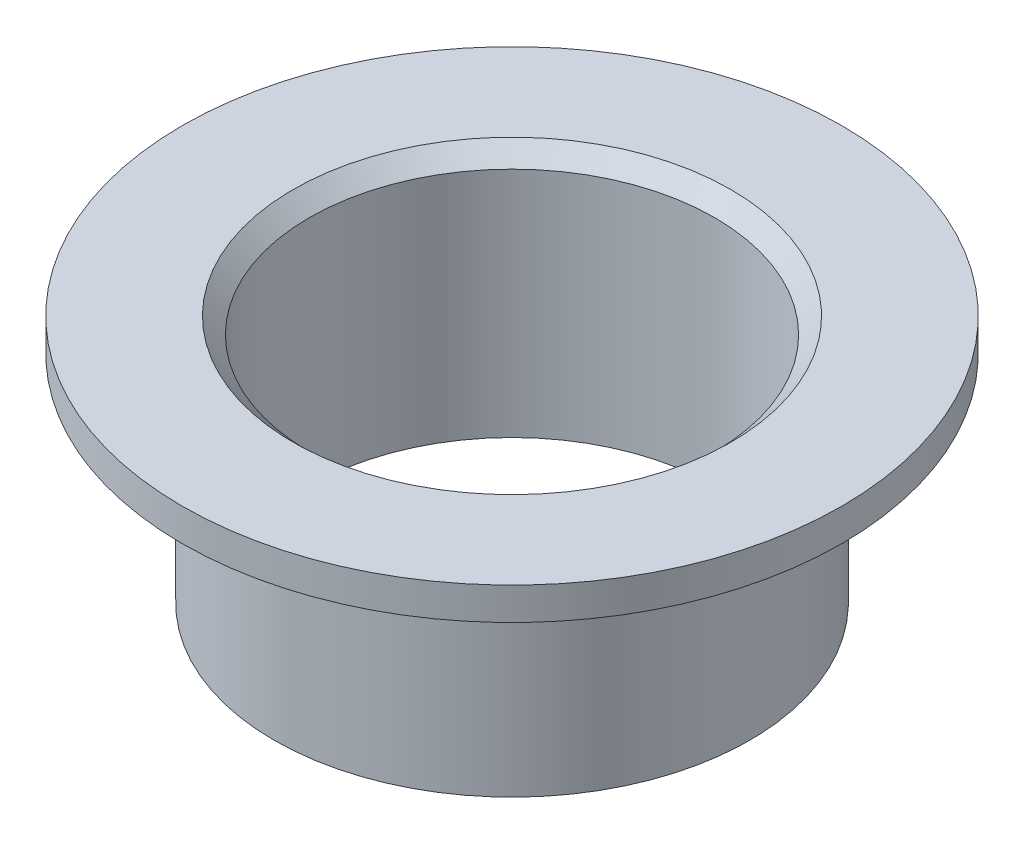
ISO-10303-21;
HEADER;
FILE_DESCRIPTION(('STEP AP214'),'2;1');
FILE_NAME('part.step','',(''),(''),'','','');
FILE_SCHEMA(('AUTOMOTIVE_DESIGN { 1 0 10303 214 1 1 1 1 }'));
ENDSEC;
DATA;
#1=APPLICATION_CONTEXT('core data for automotive mechanical design processes');
#2=APPLICATION_PROTOCOL_DEFINITION('international standard','automotive_design',2000,#1);
#3=PRODUCT_CONTEXT('',#1,'mechanical');
#4=PRODUCT('Part','Part','',(#3));
#5=PRODUCT_RELATED_PRODUCT_CATEGORY('part','',(#4));
#6=PRODUCT_DEFINITION_FORMATION('','',#4);
#7=PRODUCT_DEFINITION_CONTEXT('part definition',#1,'design');
#8=PRODUCT_DEFINITION('design','',#6,#7);
#9=PRODUCT_DEFINITION_SHAPE('','',#8);
#10=(LENGTH_UNIT() NAMED_UNIT(*) SI_UNIT(.MILLI.,.METRE.));
#11=(NAMED_UNIT(*) PLANE_ANGLE_UNIT() SI_UNIT($,.RADIAN.));
#12=(NAMED_UNIT(*) SI_UNIT($,.STERADIAN.) SOLID_ANGLE_UNIT());
#13=UNCERTAINTY_MEASURE_WITH_UNIT(LENGTH_MEASURE(1.E-05),#10,'distance_accuracy_value','');
#14=(GEOMETRIC_REPRESENTATION_CONTEXT(3) GLOBAL_UNCERTAINTY_ASSIGNED_CONTEXT((#13)) GLOBAL_UNIT_ASSIGNED_CONTEXT((#10,
#11,#12)) REPRESENTATION_CONTEXT('',''));
#15=CARTESIAN_POINT('',(0.,0.,0.));
#16=DIRECTION('',(0.,0.,1.));
#17=DIRECTION('',(1.,0.,0.));
#18=AXIS2_PLACEMENT_3D('',#15,#16,#17);
#19=CARTESIAN_POINT('',(0.,0.,0.));
#20=DIRECTION('',(0.,-1.,0.));
#21=DIRECTION('',(0.,0.,-1.));
#22=AXIS2_PLACEMENT_3D('',#19,#20,#21);
#23=CYLINDRICAL_SURFACE('',#22,37.5);
#24=CARTESIAN_POINT('',(0.,43.,0.));
#25=DIRECTION('',(0.,-1.,0.));
#26=DIRECTION('',(0.,0.,-1.));
#27=AXIS2_PLACEMENT_3D('',#24,#25,#26);
#28=CIRCLE('',#27,37.5);
#29=CARTESIAN_POINT('',(0.,43.,-37.5));
#30=VERTEX_POINT('',#29);
#31=EDGE_CURVE('E10',#30,#30,#28,.F.);
#32=ORIENTED_EDGE('',*,*,#31,.T.);
#33=EDGE_LOOP('',(#32));
#34=FACE_BOUND('',#33,.T.);
#35=CARTESIAN_POINT('',(0.,0.,0.));
#36=DIRECTION('',(0.,-1.,0.));
#37=DIRECTION('',(0.,0.,-1.));
#38=AXIS2_PLACEMENT_3D('',#35,#36,#37);
#39=CIRCLE('',#38,37.5);
#40=CARTESIAN_POINT('',(0.,0.,-37.5));
#41=VERTEX_POINT('',#40);
#42=EDGE_CURVE('E42',#41,#41,#39,.T.);
#43=ORIENTED_EDGE('',*,*,#42,.T.);
#44=EDGE_LOOP('',(#43));
#45=FACE_BOUND('',#44,.T.);
#46=ADVANCED_FACE('F31',(#34,#45),#23,.F.);
#47=CARTESIAN_POINT('',(-37.5,0.,0.));
#48=DIRECTION('',(0.,1.,0.));
#49=DIRECTION('',(0.,0.,1.));
#50=AXIS2_PLACEMENT_3D('',#47,#48,#49);
#51=PLANE('',#50);
#52=ORIENTED_EDGE('',*,*,#42,.F.);
#53=EDGE_LOOP('',(#52));
#54=FACE_BOUND('',#53,.T.);
#55=CARTESIAN_POINT('',(0.,0.,0.));
#56=DIRECTION('',(0.,-1.,0.));
#57=DIRECTION('',(0.,0.,-1.));
#58=AXIS2_PLACEMENT_3D('',#55,#56,#57);
#59=CIRCLE('',#58,44.);
#60=CARTESIAN_POINT('',(0.,0.,-44.));
#61=VERTEX_POINT('',#60);
#62=EDGE_CURVE('E46',#61,#61,#59,.T.);
#63=ORIENTED_EDGE('',*,*,#62,.T.);
#64=EDGE_LOOP('',(#63));
#65=FACE_BOUND('',#64,.T.);
#66=ADVANCED_FACE('F75',(#54,#65),#51,.F.);
#67=CARTESIAN_POINT('',(0.,0.,0.));
#68=DIRECTION('',(0.,-1.,0.));
#69=DIRECTION('',(0.,0.,-1.));
#70=AXIS2_PLACEMENT_3D('',#67,#68,#69);
#71=CYLINDRICAL_SURFACE('',#70,44.);
#72=ORIENTED_EDGE('',*,*,#62,.F.);
#73=EDGE_LOOP('',(#72));
#74=FACE_BOUND('',#73,.T.);
#75=CARTESIAN_POINT('',(0.,40.,0.));
#76=DIRECTION('',(0.,-1.,0.));
#77=DIRECTION('',(0.,0.,-1.));
#78=AXIS2_PLACEMENT_3D('',#75,#76,#77);
#79=CIRCLE('',#78,44.);
#80=CARTESIAN_POINT('',(0.,40.,-44.));
#81=VERTEX_POINT('',#80);
#82=EDGE_CURVE('E51',#81,#81,#79,.T.);
#83=ORIENTED_EDGE('',*,*,#82,.T.);
#84=EDGE_LOOP('',(#83));
#85=FACE_BOUND('',#84,.T.);
#86=ADVANCED_FACE('F79',(#74,#85),#71,.T.);
#87=CARTESIAN_POINT('',(-44.,40.,0.));
#88=DIRECTION('',(0.,1.,0.));
#89=DIRECTION('',(0.,0.,1.));
#90=AXIS2_PLACEMENT_3D('',#87,#88,#89);
#91=PLANE('',#90);
#92=ORIENTED_EDGE('',*,*,#82,.F.);
#93=EDGE_LOOP('',(#92));
#94=FACE_BOUND('',#93,.T.);
#95=CARTESIAN_POINT('',(0.,40.,0.));
#96=DIRECTION('',(0.,-1.,0.));
#97=DIRECTION('',(0.,0.,-1.));
#98=AXIS2_PLACEMENT_3D('',#95,#96,#97);
#99=CIRCLE('',#98,61.);
#100=CARTESIAN_POINT('',(0.,40.,-61.));
#101=VERTEX_POINT('',#100);
#102=EDGE_CURVE('E54',#101,#101,#99,.T.);
#103=ORIENTED_EDGE('',*,*,#102,.T.);
#104=EDGE_LOOP('',(#103));
#105=FACE_BOUND('',#104,.T.);
#106=ADVANCED_FACE('F71',(#94,#105),#91,.F.);
#107=CARTESIAN_POINT('',(0.,0.,0.));
#108=DIRECTION('',(0.,-1.,0.));
#109=DIRECTION('',(0.,0.,-1.));
#110=AXIS2_PLACEMENT_3D('',#107,#108,#109);
#111=CYLINDRICAL_SURFACE('',#110,61.);
#112=ORIENTED_EDGE('',*,*,#102,.F.);
#113=EDGE_LOOP('',(#112));
#114=FACE_BOUND('',#113,.T.);
#115=CARTESIAN_POINT('',(0.,46.,0.));
#116=DIRECTION('',(0.,-1.,0.));
#117=DIRECTION('',(0.,0.,-1.));
#118=AXIS2_PLACEMENT_3D('',#115,#116,#117);
#119=CIRCLE('',#118,61.);
#120=CARTESIAN_POINT('',(0.,46.,-61.));
#121=VERTEX_POINT('',#120);
#122=EDGE_CURVE('E57',#121,#121,#119,.T.);
#123=ORIENTED_EDGE('',*,*,#122,.T.);
#124=EDGE_LOOP('',(#123));
#125=FACE_BOUND('',#124,.T.);
#126=ADVANCED_FACE('F61',(#114,#125),#111,.T.);
#127=CARTESIAN_POINT('',(-61.,46.,0.));
#128=DIRECTION('',(0.,-1.,0.));
#129=DIRECTION('',(0.,0.,-1.));
#130=AXIS2_PLACEMENT_3D('',#127,#128,#129);
#131=PLANE('',#130);
#132=CARTESIAN_POINT('',(0.,46.,0.));
#133=DIRECTION('',(0.,-1.,0.));
#134=DIRECTION('',(0.,0.,-1.));
#135=AXIS2_PLACEMENT_3D('',#132,#133,#134);
#136=CIRCLE('',#135,40.5);
#137=CARTESIAN_POINT('',(0.,46.,-40.5));
#138=VERTEX_POINT('',#137);
#139=EDGE_CURVE('E38',#138,#138,#136,.T.);
#140=ORIENTED_EDGE('',*,*,#139,.T.);
#141=EDGE_LOOP('',(#140));
#142=FACE_BOUND('',#141,.T.);
#143=ORIENTED_EDGE('',*,*,#122,.F.);
#144=EDGE_LOOP('',(#143));
#145=FACE_BOUND('',#144,.T.);
#146=ADVANCED_FACE('F63',(#142,#145),#131,.F.);
#147=CARTESIAN_POINT('',(0.,46.,0.));
#148=DIRECTION('',(0.,1.,0.));
#149=DIRECTION('',(0.,0.,1.));
#150=AXIS2_PLACEMENT_3D('',#147,#148,#149);
#151=CONICAL_SURFACE('',#150,40.5,0.785398163397446);
#152=ORIENTED_EDGE('',*,*,#31,.F.);
#153=EDGE_LOOP('',(#152));
#154=FACE_BOUND('',#153,.T.);
#155=ORIENTED_EDGE('',*,*,#139,.F.);
#156=EDGE_LOOP('',(#155));
#157=FACE_BOUND('',#156,.T.);
#158=ADVANCED_FACE('F33',(#154,#157),#151,.F.);
#159=CLOSED_SHELL('',(#46,#66,#86,#106,#126,#146,#158));
#160=MANIFOLD_SOLID_BREP('B2',#159);
#161=ADVANCED_BREP_SHAPE_REPRESENTATION('',(#18,#160),#14);
#162=SHAPE_DEFINITION_REPRESENTATION(#9,#161);
ENDSEC;
END-ISO-10303-21;
